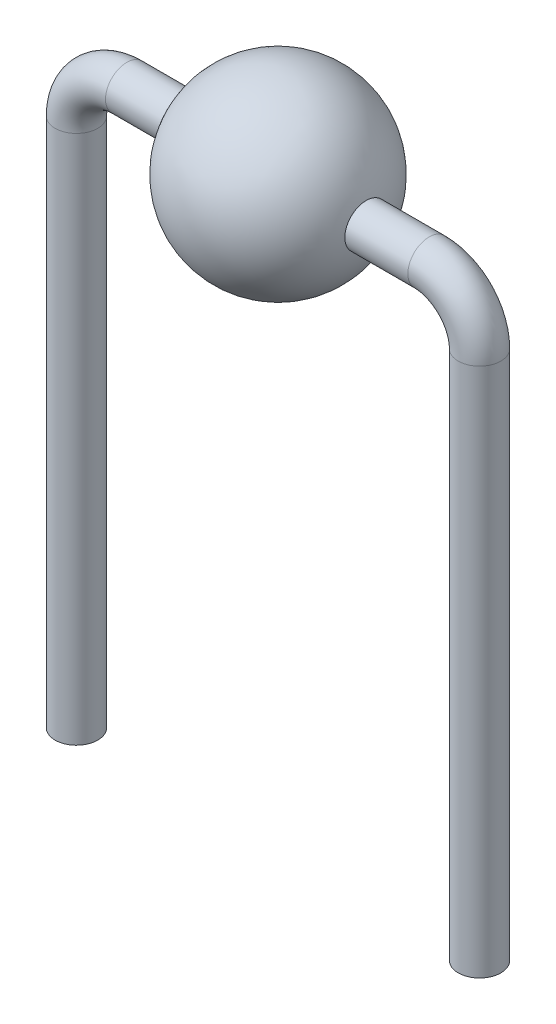
ISO-10303-21;
HEADER;
FILE_DESCRIPTION(('STEP AP214'),'2;1');
FILE_NAME('part.step','',(''),(''),'','','');
FILE_SCHEMA(('AUTOMOTIVE_DESIGN { 1 0 10303 214 1 1 1 1 }'));
ENDSEC;
DATA;
#1=APPLICATION_CONTEXT('core data for automotive mechanical design processes');
#2=APPLICATION_PROTOCOL_DEFINITION('international standard','automotive_design',2000,#1);
#3=PRODUCT_CONTEXT('',#1,'mechanical');
#4=PRODUCT('Part','Part','',(#3));
#5=PRODUCT_RELATED_PRODUCT_CATEGORY('part','',(#4));
#6=PRODUCT_DEFINITION_FORMATION('','',#4);
#7=PRODUCT_DEFINITION_CONTEXT('part definition',#1,'design');
#8=PRODUCT_DEFINITION('design','',#6,#7);
#9=PRODUCT_DEFINITION_SHAPE('','',#8);
#10=(LENGTH_UNIT() NAMED_UNIT(*) SI_UNIT(.MILLI.,.METRE.));
#11=(NAMED_UNIT(*) PLANE_ANGLE_UNIT() SI_UNIT($,.RADIAN.));
#12=(NAMED_UNIT(*) SI_UNIT($,.STERADIAN.) SOLID_ANGLE_UNIT());
#13=UNCERTAINTY_MEASURE_WITH_UNIT(LENGTH_MEASURE(1.E-05),#10,'distance_accuracy_value','');
#14=(GEOMETRIC_REPRESENTATION_CONTEXT(3) GLOBAL_UNCERTAINTY_ASSIGNED_CONTEXT((#13)) GLOBAL_UNIT_ASSIGNED_CONTEXT((#10,
#11,#12)) REPRESENTATION_CONTEXT('',''));
#15=CARTESIAN_POINT('',(0.,0.,0.));
#16=DIRECTION('',(0.,0.,1.));
#17=DIRECTION('',(1.,0.,0.));
#18=AXIS2_PLACEMENT_3D('',#15,#16,#17);
#19=CARTESIAN_POINT('',(0.,0.,0.));
#20=DIRECTION('',(-1.,0.,0.));
#21=DIRECTION('',(0.,0.,-1.));
#22=AXIS2_PLACEMENT_3D('',#19,#20,#21);
#23=SPHERICAL_SURFACE('',#22,1.8);
#24=CARTESIAN_POINT('',(1.74957838479417,0.,0.));
#25=DIRECTION('',(-1.,0.,0.));
#26=DIRECTION('',(0.,0.,1.));
#27=AXIS2_PLACEMENT_3D('',#24,#25,#26);
#28=CIRCLE('',#27,0.423054931966297);
#29=CARTESIAN_POINT('',(1.74957838479417,0.,-0.423054931966296));
#30=VERTEX_POINT('',#29);
#31=EDGE_CURVE('E61',#30,#30,#28,.T.);
#32=CARTESIAN_POINT('',(-1.74957838479417,0.,0.));
#33=DIRECTION('',(-1.,0.,0.));
#34=DIRECTION('',(0.,0.,1.));
#35=AXIS2_PLACEMENT_3D('',#32,#33,#34);
#36=CIRCLE('',#35,0.423054931966296);
#37=CARTESIAN_POINT('',(-1.74957838479417,0.,-0.423054931966299));
#38=VERTEX_POINT('',#37);
#39=EDGE_CURVE('E10',#38,#38,#36,.T.);
#40=CARTESIAN_POINT('',(1.74957838479417,0.,-0.423054931966296));
#41=CARTESIAN_POINT('',(1.73782991848519,0.,-0.471663721621434));
#42=CARTESIAN_POINT('',(1.72404611129111,0.,-0.519779586599979));
#43=CARTESIAN_POINT('',(1.69252515765866,0.,-0.614698603665015));
#44=CARTESIAN_POINT('',(1.67478801122029,0.,-0.661501755751506));
#45=CARTESIAN_POINT('',(1.63547772162515,0.,-0.753468483493568));
#46=CARTESIAN_POINT('',(1.61390457846839,0.,-0.798632059149139));
#47=CARTESIAN_POINT('',(1.56707362421985,0.,-0.88700659549257));
#48=CARTESIAN_POINT('',(1.54181581312808,0.,-0.93021755618043));
#49=CARTESIAN_POINT('',(1.48779046254893,0.,-1.01438672602675));
#50=CARTESIAN_POINT('',(1.45902292306155,0.,-1.05534493518522));
#51=CARTESIAN_POINT('',(1.39817795003781,0.,-1.13472428078953));
#52=CARTESIAN_POINT('',(1.36610051650144,0.,-1.17314541723539));
#53=CARTESIAN_POINT('',(1.2988584276587,0.,-1.24718386324296));
#54=CARTESIAN_POINT('',(1.26369377235233,0.,-1.28280117280468));
#55=CARTESIAN_POINT('',(1.19052138363774,0.,-1.35098468943025));
#56=CARTESIAN_POINT('',(1.15251365022953,0.,-1.3835508964941));
#57=CARTESIAN_POINT('',(1.0739189772985,0.,-1.44540611185344));
#58=CARTESIAN_POINT('',(1.03333203777569,0.,-1.47469512014892));
#59=CARTESIAN_POINT('',(0.949860733832473,0.,-1.52979259502669));
#60=CARTESIAN_POINT('',(0.906976369412063,0.,-1.55560106160898));
#61=CARTESIAN_POINT('',(0.819207946362784,0.,-1.60355827403285));
#62=CARTESIAN_POINT('',(0.774323887733915,0.,-1.62570701987441));
#63=CARTESIAN_POINT('',(0.682867690315784,0.,-1.66619101998968));
#64=CARTESIAN_POINT('',(0.636295551526521,0.,-1.68452627426337));
#65=CARTESIAN_POINT('',(0.541786527521638,0.,-1.71725599610985));
#66=CARTESIAN_POINT('',(0.493849642306018,0.,-1.73165046368264));
#67=CARTESIAN_POINT('',(0.396943934144054,0.,-1.75639867647512));
#68=CARTESIAN_POINT('',(0.347975111197711,0.,-1.76675242169483));
#69=CARTESIAN_POINT('',(0.249345500641701,0.,-1.7833473074215));
#70=CARTESIAN_POINT('',(0.199684713032034,0.,-1.78958844792847));
#71=CARTESIAN_POINT('',(0.100015950281579,0.,-1.79791479421772));
#72=CARTESIAN_POINT('',(0.05000797514079,0.,-1.8));
#73=CARTESIAN_POINT('',(-0.050007975140787,0.,-1.8));
#74=CARTESIAN_POINT('',(-0.100015950281576,0.,-1.79791479421772));
#75=CARTESIAN_POINT('',(-0.199684713032031,0.,-1.78958844792847));
#76=CARTESIAN_POINT('',(-0.249345500641698,0.,-1.7833473074215));
#77=CARTESIAN_POINT('',(-0.347975111197708,0.,-1.76675242169483));
#78=CARTESIAN_POINT('',(-0.396943934144051,0.,-1.75639867647513));
#79=CARTESIAN_POINT('',(-0.493849642306015,0.,-1.73165046368264));
#80=CARTESIAN_POINT('',(-0.541786527521635,0.,-1.71725599610985));
#81=CARTESIAN_POINT('',(-0.636295551526518,0.,-1.68452627426337));
#82=CARTESIAN_POINT('',(-0.682867690315781,0.,-1.66619101998968));
#83=CARTESIAN_POINT('',(-0.774323887733912,0.,-1.62570701987442));
#84=CARTESIAN_POINT('',(-0.819207946362781,0.,-1.60355827403285));
#85=CARTESIAN_POINT('',(-0.90697636941206,0.,-1.55560106160899));
#86=CARTESIAN_POINT('',(-0.949860733832471,0.,-1.52979259502669));
#87=CARTESIAN_POINT('',(-1.03333203777569,0.,-1.47469512014892));
#88=CARTESIAN_POINT('',(-1.0739189772985,0.,-1.44540611185344));
#89=CARTESIAN_POINT('',(-1.15251365022952,0.,-1.38355089649411));
#90=CARTESIAN_POINT('',(-1.19052138363774,0.,-1.35098468943025));
#91=CARTESIAN_POINT('',(-1.26369377235233,0.,-1.28280117280468));
#92=CARTESIAN_POINT('',(-1.2988584276587,0.,-1.24718386324297));
#93=CARTESIAN_POINT('',(-1.36610051650144,0.,-1.17314541723539));
#94=CARTESIAN_POINT('',(-1.39817795003781,0.,-1.13472428078954));
#95=CARTESIAN_POINT('',(-1.45902292306155,0.,-1.05534493518522));
#96=CARTESIAN_POINT('',(-1.48779046254893,0.,-1.01438672602676));
#97=CARTESIAN_POINT('',(-1.54181581312808,0.,-0.930217556180433));
#98=CARTESIAN_POINT('',(-1.56707362421985,0.,-0.887006595492573));
#99=CARTESIAN_POINT('',(-1.61390457846839,0.,-0.798632059149141));
#100=CARTESIAN_POINT('',(-1.63547772162515,0.,-0.753468483493571));
#101=CARTESIAN_POINT('',(-1.67478801122029,0.,-0.661501755751509));
#102=CARTESIAN_POINT('',(-1.69252515765866,0.,-0.614698603665017));
#103=CARTESIAN_POINT('',(-1.72404611129111,0.,-0.519779586599981));
#104=CARTESIAN_POINT('',(-1.73782991848519,0.,-0.471663721621437));
#105=CARTESIAN_POINT('',(-1.74957838479417,0.,-0.423054931966299));
#106=B_SPLINE_CURVE_WITH_KNOTS('',3,(#40,#41,#42,#43,#44,#45,#46,#47,#48,#49,#50,#51,#52,#53,
#54,#55,#56,#57,#58,#59,#60,#61,#62,#63,#64,#65,#66,#67,#68,#69,#70,#71,#72,#73,#74,#75,#76,#77,
#78,#79,#80,#81,#82,#83,#84,#85,#86,#87,#88,#89,#90,#91,#92,#93,#94,#95,#96,#97,#98,#99,#100,
#101,#102,#103,#104,#105),.UNSPECIFIED.,.F.,.F.,(4,2,2,2,2,2,2,2,2,2,2,2,2,2,2,2,2,2,2,2,2,2,2,
2,2,2,2,2,2,2,2,2,4),(0.,0.14998054586135,0.299961091722701,0.449941637584051,0.599922183445401,
0.749902729306751,0.899883275168101,1.04986382102945,1.1998443668908,1.34982491275215,
1.4998054586135,1.64978600447485,1.7997665503362,1.94974709619755,2.0997276420589,
2.24970818792025,2.3996887337816,2.54966927964295,2.6996498255043,2.84963037136565,
2.999610917227,3.14959146308835,3.2995720089497,3.44955255481105,3.5995331006724,
3.74951364653376,3.8994941923951,4.04947473825646,4.19945528411781,4.34943582997916,
4.49941637584051,4.64939692170186,4.79937746756321),.UNSPECIFIED.);
#107=EDGE_CURVE('BSEAM35',#30,#38,#106,.T.);
#108=ORIENTED_EDGE('',*,*,#31,.T.);
#109=ORIENTED_EDGE('',*,*,#39,.F.);
#110=ORIENTED_EDGE('',*,*,#107,.T.);
#111=ORIENTED_EDGE('',*,*,#107,.F.);
#112=EDGE_LOOP('',(#108,#110,#109,#111));
#113=FACE_BOUND('',#112,.T.);
#114=ADVANCED_FACE('F35',(#113),#23,.T.);
#115=CARTESIAN_POINT('',(-4.,-1.,0.));
#116=DIRECTION('',(0.,-1.,0.));
#117=DIRECTION('',(1.,0.,0.));
#118=AXIS2_PLACEMENT_3D('',#115,#116,#117);
#119=CYLINDRICAL_SURFACE('',#118,0.423054931966297);
#120=CARTESIAN_POINT('',(-4.,-1.,0.));
#121=DIRECTION('',(0.,-1.,0.));
#122=DIRECTION('',(0.,0.,1.));
#123=AXIS2_PLACEMENT_3D('',#120,#121,#122);
#124=CIRCLE('',#123,0.423054931966297);
#125=CARTESIAN_POINT('',(-4.4230549319663,-1.,0.));
#126=VERTEX_POINT('',#125);
#127=EDGE_CURVE('E45',#126,#126,#124,.T.);
#128=ORIENTED_EDGE('',*,*,#127,.T.);
#129=EDGE_LOOP('',(#128));
#130=FACE_BOUND('',#129,.T.);
#131=CARTESIAN_POINT('',(-4.,-11.514871197813,0.));
#132=DIRECTION('',(0.,-1.,0.));
#133=DIRECTION('',(0.,0.,1.));
#134=AXIS2_PLACEMENT_3D('',#131,#132,#133);
#135=CIRCLE('',#134,0.423054931966297);
#136=CARTESIAN_POINT('',(-4.,-11.514871197813,0.423054931966297));
#137=VERTEX_POINT('',#136);
#138=EDGE_CURVE('E41',#137,#137,#135,.T.);
#139=ORIENTED_EDGE('',*,*,#138,.F.);
#140=EDGE_LOOP('',(#139));
#141=FACE_BOUND('',#140,.T.);
#142=ADVANCED_FACE('F91',(#130,#141),#119,.T.);
#143=CARTESIAN_POINT('',(-3.,-1.,0.));
#144=DIRECTION('',(0.,0.,1.));
#145=DIRECTION('',(1.,0.,0.));
#146=AXIS2_PLACEMENT_3D('',#143,#144,#145);
#147=TOROIDAL_SURFACE('',#146,1.,0.423054931966297);
#148=CARTESIAN_POINT('',(-3.,0.,0.));
#149=DIRECTION('',(-1.,0.,0.));
#150=DIRECTION('',(0.,0.,1.));
#151=AXIS2_PLACEMENT_3D('',#148,#149,#150);
#152=CIRCLE('',#151,0.423054931966297);
#153=CARTESIAN_POINT('',(-3.,0.423054931966297,0.));
#154=VERTEX_POINT('',#153);
#155=EDGE_CURVE('E49',#154,#154,#152,.T.);
#156=CARTESIAN_POINT('',(-3.,-1.,0.));
#157=DIRECTION('',(0.,0.,1.));
#158=DIRECTION('',(1.,0.,0.));
#159=AXIS2_PLACEMENT_3D('',#156,#157,#158);
#160=CIRCLE('',#159,1.4230549319663);
#161=EDGE_CURVE('',#154,#126,#160,.T.);
#162=ORIENTED_EDGE('',*,*,#155,.T.);
#163=ORIENTED_EDGE('',*,*,#127,.F.);
#164=ORIENTED_EDGE('',*,*,#161,.T.);
#165=ORIENTED_EDGE('',*,*,#161,.F.);
#166=EDGE_LOOP('',(#162,#164,#163,#165));
#167=FACE_BOUND('',#166,.T.);
#168=ADVANCED_FACE('F96',(#167),#147,.T.);
#169=CARTESIAN_POINT('',(-3.,0.,0.));
#170=DIRECTION('',(1.,0.,0.));
#171=DIRECTION('',(0.,1.,0.));
#172=AXIS2_PLACEMENT_3D('',#169,#170,#171);
#173=CYLINDRICAL_SURFACE('',#172,0.423054931966297);
#174=ORIENTED_EDGE('',*,*,#155,.F.);
#175=EDGE_LOOP('',(#174));
#176=FACE_BOUND('',#175,.T.);
#177=ORIENTED_EDGE('',*,*,#39,.T.);
#178=EDGE_LOOP('',(#177));
#179=FACE_BOUND('',#178,.T.);
#180=ADVANCED_FACE('F103',(#176,#179),#173,.T.);
#181=CARTESIAN_POINT('',(-4.,-11.514871197813,0.));
#182=DIRECTION('',(0.,-1.,0.));
#183=DIRECTION('',(0.,0.,1.));
#184=AXIS2_PLACEMENT_3D('',#181,#182,#183);
#185=PLANE('',#184);
#186=ORIENTED_EDGE('',*,*,#138,.T.);
#187=EDGE_LOOP('',(#186));
#188=FACE_BOUND('',#187,.T.);
#189=ADVANCED_FACE('F79',(#188),#185,.T.);
#190=CARTESIAN_POINT('',(4.,-1.,0.));
#191=DIRECTION('',(0.,-1.,0.));
#192=DIRECTION('',(1.,0.,0.));
#193=AXIS2_PLACEMENT_3D('',#190,#191,#192);
#194=CYLINDRICAL_SURFACE('',#193,0.423054931966297);
#195=CARTESIAN_POINT('',(4.,-1.,0.));
#196=DIRECTION('',(0.,1.,0.));
#197=DIRECTION('',(0.,0.,1.));
#198=AXIS2_PLACEMENT_3D('',#195,#196,#197);
#199=CIRCLE('',#198,0.423054931966297);
#200=CARTESIAN_POINT('',(4.4230549319663,-1.,0.));
#201=VERTEX_POINT('',#200);
#202=EDGE_CURVE('E57',#201,#201,#199,.T.);
#203=ORIENTED_EDGE('',*,*,#202,.F.);
#204=EDGE_LOOP('',(#203));
#205=FACE_BOUND('',#204,.T.);
#206=CARTESIAN_POINT('',(4.,-11.514871197813,0.));
#207=DIRECTION('',(0.,1.,0.));
#208=DIRECTION('',(0.,0.,1.));
#209=AXIS2_PLACEMENT_3D('',#206,#207,#208);
#210=CIRCLE('',#209,0.423054931966297);
#211=CARTESIAN_POINT('',(4.,-11.514871197813,0.423054931966297));
#212=VERTEX_POINT('',#211);
#213=EDGE_CURVE('E54',#212,#212,#210,.T.);
#214=ORIENTED_EDGE('',*,*,#213,.T.);
#215=EDGE_LOOP('',(#214));
#216=FACE_BOUND('',#215,.T.);
#217=ADVANCED_FACE('F73',(#205,#216),#194,.T.);
#218=CARTESIAN_POINT('',(3.,-1.,0.));
#219=DIRECTION('',(0.,0.,-1.));
#220=DIRECTION('',(-1.,0.,0.));
#221=AXIS2_PLACEMENT_3D('',#218,#219,#220);
#222=TOROIDAL_SURFACE('',#221,1.,0.423054931966297);
#223=CARTESIAN_POINT('',(3.,0.,0.));
#224=DIRECTION('',(-1.,0.,0.));
#225=DIRECTION('',(0.,0.,1.));
#226=AXIS2_PLACEMENT_3D('',#223,#224,#225);
#227=CIRCLE('',#226,0.423054931966297);
#228=CARTESIAN_POINT('',(3.,0.423054931966297,0.));
#229=VERTEX_POINT('',#228);
#230=EDGE_CURVE('E60',#229,#229,#227,.T.);
#231=CARTESIAN_POINT('',(3.,-1.,0.));
#232=DIRECTION('',(0.,0.,-1.));
#233=DIRECTION('',(-1.,0.,0.));
#234=AXIS2_PLACEMENT_3D('',#231,#232,#233);
#235=CIRCLE('',#234,1.4230549319663);
#236=EDGE_CURVE('',#229,#201,#235,.T.);
#237=ORIENTED_EDGE('',*,*,#230,.F.);
#238=ORIENTED_EDGE('',*,*,#202,.T.);
#239=ORIENTED_EDGE('',*,*,#236,.T.);
#240=ORIENTED_EDGE('',*,*,#236,.F.);
#241=EDGE_LOOP('',(#237,#239,#238,#240));
#242=FACE_BOUND('',#241,.T.);
#243=ADVANCED_FACE('F70',(#242),#222,.T.);
#244=CARTESIAN_POINT('',(3.,0.,0.));
#245=DIRECTION('',(-1.,0.,0.));
#246=DIRECTION('',(0.,-1.,0.));
#247=AXIS2_PLACEMENT_3D('',#244,#245,#246);
#248=CYLINDRICAL_SURFACE('',#247,0.423054931966297);
#249=ORIENTED_EDGE('',*,*,#230,.T.);
#250=EDGE_LOOP('',(#249));
#251=FACE_BOUND('',#250,.T.);
#252=ORIENTED_EDGE('',*,*,#31,.F.);
#253=EDGE_LOOP('',(#252));
#254=FACE_BOUND('',#253,.T.);
#255=ADVANCED_FACE('F67',(#251,#254),#248,.T.);
#256=CARTESIAN_POINT('',(4.,-11.514871197813,0.));
#257=DIRECTION('',(0.,-1.,0.));
#258=DIRECTION('',(0.,0.,1.));
#259=AXIS2_PLACEMENT_3D('',#256,#257,#258);
#260=PLANE('',#259);
#261=ORIENTED_EDGE('',*,*,#213,.F.);
#262=EDGE_LOOP('',(#261));
#263=FACE_BOUND('',#262,.T.);
#264=ADVANCED_FACE('F83',(#263),#260,.T.);
#265=CLOSED_SHELL('',(#114,#142,#168,#180,#189,#217,#243,#255,#264));
#266=MANIFOLD_SOLID_BREP('B2',#265);
#267=ADVANCED_BREP_SHAPE_REPRESENTATION('',(#18,#266),#14);
#268=SHAPE_DEFINITION_REPRESENTATION(#9,#267);
ENDSEC;
END-ISO-10303-21;
